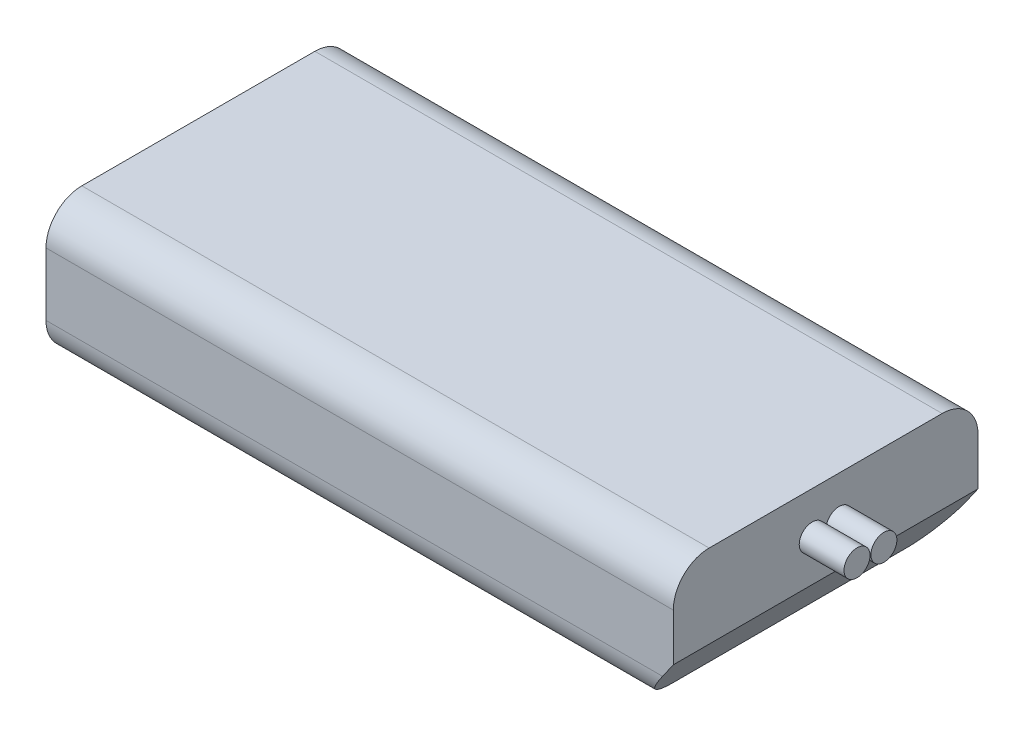
ISO-10303-21;
HEADER;
FILE_DESCRIPTION(('STEP AP214'),'2;1');
FILE_NAME('part.step','',(''),(''),'','','');
FILE_SCHEMA(('AUTOMOTIVE_DESIGN { 1 0 10303 214 1 1 1 1 }'));
ENDSEC;
DATA;
#1=APPLICATION_CONTEXT('core data for automotive mechanical design processes');
#2=APPLICATION_PROTOCOL_DEFINITION('international standard','automotive_design',2000,#1);
#3=PRODUCT_CONTEXT('',#1,'mechanical');
#4=PRODUCT('Part','Part','',(#3));
#5=PRODUCT_RELATED_PRODUCT_CATEGORY('part','',(#4));
#6=PRODUCT_DEFINITION_FORMATION('','',#4);
#7=PRODUCT_DEFINITION_CONTEXT('part definition',#1,'design');
#8=PRODUCT_DEFINITION('design','',#6,#7);
#9=PRODUCT_DEFINITION_SHAPE('','',#8);
#10=(LENGTH_UNIT() NAMED_UNIT(*) SI_UNIT(.MILLI.,.METRE.));
#11=(NAMED_UNIT(*) PLANE_ANGLE_UNIT() SI_UNIT($,.RADIAN.));
#12=(NAMED_UNIT(*) SI_UNIT($,.STERADIAN.) SOLID_ANGLE_UNIT());
#13=UNCERTAINTY_MEASURE_WITH_UNIT(LENGTH_MEASURE(1.E-05),#10,'distance_accuracy_value','');
#14=(GEOMETRIC_REPRESENTATION_CONTEXT(3) GLOBAL_UNCERTAINTY_ASSIGNED_CONTEXT((#13)) GLOBAL_UNIT_ASSIGNED_CONTEXT((#10,
#11,#12)) REPRESENTATION_CONTEXT('',''));
#15=CARTESIAN_POINT('',(0.,0.,0.));
#16=DIRECTION('',(0.,0.,1.));
#17=DIRECTION('',(1.,0.,0.));
#18=AXIS2_PLACEMENT_3D('',#15,#16,#17);
#19=CARTESIAN_POINT('',(17.5,7.5,8.5));
#20=DIRECTION('',(-1.,0.,0.));
#21=DIRECTION('',(0.,0.,1.));
#22=AXIS2_PLACEMENT_3D('',#19,#20,#21);
#23=PLANE('',#22);
#24=CARTESIAN_POINT('',(17.5,5.15797983863386,-0.75));
#25=DIRECTION('',(-1.,0.,0.));
#26=DIRECTION('',(0.,0.,1.));
#27=AXIS2_PLACEMENT_3D('',#24,#25,#26);
#28=CIRCLE('',#27,0.725);
#29=CARTESIAN_POINT('',(17.5,5.15797983863386,-0.0250000000000003));
#30=VERTEX_POINT('',#29);
#31=EDGE_CURVE('E11',#30,#30,#28,.F.);
#32=ORIENTED_EDGE('',*,*,#31,.F.);
#33=EDGE_LOOP('',(#32));
#34=FACE_BOUND('',#33,.T.);
#35=CARTESIAN_POINT('',(17.5,5.15797983863386,0.75));
#36=DIRECTION('',(-1.,0.,0.));
#37=DIRECTION('',(0.,0.,1.));
#38=AXIS2_PLACEMENT_3D('',#35,#36,#37);
#39=CIRCLE('',#38,0.725);
#40=CARTESIAN_POINT('',(17.5,5.15797983863386,1.475));
#41=VERTEX_POINT('',#40);
#42=EDGE_CURVE('E43',#41,#41,#39,.F.);
#43=ORIENTED_EDGE('',*,*,#42,.F.);
#44=EDGE_LOOP('',(#43));
#45=FACE_BOUND('',#44,.T.);
#46=DIRECTION('',(0.,-1.,0.));
#47=VECTOR('',#46,1.);
#48=CARTESIAN_POINT('',(17.5,7.5,-8.5));
#49=LINE('',#48,#47);
#50=CARTESIAN_POINT('',(17.5,5.5,-8.5));
#51=VERTEX_POINT('',#50);
#52=CARTESIAN_POINT('',(17.5,2.85629601348422,-8.5));
#53=VERTEX_POINT('',#52);
#54=EDGE_CURVE('E108',#51,#53,#49,.T.);
#55=ORIENTED_EDGE('',*,*,#54,.F.);
#56=CARTESIAN_POINT('',(17.5,5.5,-6.5));
#57=DIRECTION('',(-1.,0.,0.));
#58=DIRECTION('',(0.,0.,1.));
#59=AXIS2_PLACEMENT_3D('',#56,#57,#58);
#60=CIRCLE('',#59,2.);
#61=CARTESIAN_POINT('',(17.5,7.5,-6.5));
#62=VERTEX_POINT('',#61);
#63=EDGE_CURVE('E50',#51,#62,#60,.F.);
#64=ORIENTED_EDGE('',*,*,#63,.T.);
#65=DIRECTION('',(0.,0.,-1.));
#66=VECTOR('',#65,1.);
#67=CARTESIAN_POINT('',(17.5,7.5,8.5));
#68=LINE('',#67,#66);
#69=CARTESIAN_POINT('',(17.5,7.5,6.5));
#70=VERTEX_POINT('',#69);
#71=EDGE_CURVE('E210',#70,#62,#68,.T.);
#72=ORIENTED_EDGE('',*,*,#71,.F.);
#73=CARTESIAN_POINT('',(17.5,5.5,6.5));
#74=DIRECTION('',(-1.,0.,0.));
#75=DIRECTION('',(0.,0.,1.));
#76=AXIS2_PLACEMENT_3D('',#73,#74,#75);
#77=CIRCLE('',#76,2.);
#78=CARTESIAN_POINT('',(17.5,5.5,8.5));
#79=VERTEX_POINT('',#78);
#80=EDGE_CURVE('E58',#70,#79,#77,.F.);
#81=ORIENTED_EDGE('',*,*,#80,.T.);
#82=DIRECTION('',(0.,-1.,0.));
#83=VECTOR('',#82,1.);
#84=CARTESIAN_POINT('',(17.5,7.5,8.5));
#85=LINE('',#84,#83);
#86=CARTESIAN_POINT('',(17.5,2.85629601348422,8.5));
#87=VERTEX_POINT('',#86);
#88=EDGE_CURVE('E131',#79,#87,#85,.T.);
#89=ORIENTED_EDGE('',*,*,#88,.T.);
#90=DIRECTION('',(0.,0.,-1.));
#91=VECTOR('',#90,1.);
#92=CARTESIAN_POINT('',(17.5,2.85629601348422,-8.5));
#93=LINE('',#92,#91);
#94=EDGE_CURVE('E118',#87,#53,#93,.T.);
#95=ORIENTED_EDGE('',*,*,#94,.T.);
#96=EDGE_LOOP('',(#55,#64,#72,#81,#89,#95));
#97=FACE_BOUND('',#96,.T.);
#98=ADVANCED_FACE('F35',(#34,#45,#97),#23,.F.);
#99=CARTESIAN_POINT('',(-17.5,7.5,-8.5));
#100=DIRECTION('',(0.,0.,1.));
#101=DIRECTION('',(1.,0.,0.));
#102=AXIS2_PLACEMENT_3D('',#99,#100,#101);
#103=PLANE('',#102);
#104=DIRECTION('',(-0.573576436351048,-0.81915204428899,0.));
#105=VECTOR('',#104,1.);
#106=CARTESIAN_POINT('',(17.5,2.85629601348422,-8.5));
#107=LINE('',#106,#105);
#108=CARTESIAN_POINT('',(16.9004150764194,2.,-8.5));
#109=VERTEX_POINT('',#108);
#110=EDGE_CURVE('E112',#53,#109,#107,.T.);
#111=ORIENTED_EDGE('',*,*,#110,.T.);
#112=DIRECTION('',(-1.,0.,0.));
#113=VECTOR('',#112,1.);
#114=CARTESIAN_POINT('',(-17.5,2.,-8.5));
#115=LINE('',#114,#113);
#116=CARTESIAN_POINT('',(-17.5,2.,-8.5));
#117=VERTEX_POINT('',#116);
#118=EDGE_CURVE('E141',#109,#117,#115,.T.);
#119=ORIENTED_EDGE('',*,*,#118,.T.);
#120=DIRECTION('',(0.,-1.,0.));
#121=VECTOR('',#120,1.);
#122=CARTESIAN_POINT('',(-17.5,7.5,-8.5));
#123=LINE('',#122,#121);
#124=CARTESIAN_POINT('',(-17.5,5.5,-8.5));
#125=VERTEX_POINT('',#124);
#126=EDGE_CURVE('E119',#125,#117,#123,.T.);
#127=ORIENTED_EDGE('',*,*,#126,.F.);
#128=DIRECTION('',(-1.,0.,0.));
#129=VECTOR('',#128,1.);
#130=CARTESIAN_POINT('',(-17.5,5.5,-8.5));
#131=LINE('',#130,#129);
#132=EDGE_CURVE('E116',#125,#51,#131,.F.);
#133=ORIENTED_EDGE('',*,*,#132,.T.);
#134=ORIENTED_EDGE('',*,*,#54,.T.);
#135=EDGE_LOOP('',(#111,#119,#127,#133,#134));
#136=FACE_BOUND('',#135,.T.);
#137=ADVANCED_FACE('F110',(#136),#103,.F.);
#138=CARTESIAN_POINT('',(-17.5,7.5,8.5));
#139=DIRECTION('',(1.,0.,0.));
#140=DIRECTION('',(0.,0.,-1.));
#141=AXIS2_PLACEMENT_3D('',#138,#139,#140);
#142=PLANE('',#141);
#143=ORIENTED_EDGE('',*,*,#126,.T.);
#144=CARTESIAN_POINT('',(-17.5,2.,-6.5));
#145=DIRECTION('',(1.,0.,0.));
#146=DIRECTION('',(0.,0.,-1.));
#147=AXIS2_PLACEMENT_3D('',#144,#145,#146);
#148=CIRCLE('',#147,2.);
#149=CARTESIAN_POINT('',(-17.5,0.,-6.5));
#150=VERTEX_POINT('',#149);
#151=EDGE_CURVE('E149',#117,#150,#148,.F.);
#152=ORIENTED_EDGE('',*,*,#151,.T.);
#153=DIRECTION('',(0.,0.,1.));
#154=VECTOR('',#153,1.);
#155=CARTESIAN_POINT('',(-17.5,0.,8.5));
#156=LINE('',#155,#154);
#157=CARTESIAN_POINT('',(-17.5,0.,6.5));
#158=VERTEX_POINT('',#157);
#159=EDGE_CURVE('E218',#150,#158,#156,.T.);
#160=ORIENTED_EDGE('',*,*,#159,.T.);
#161=CARTESIAN_POINT('',(-17.5,2.,6.5));
#162=DIRECTION('',(1.,0.,0.));
#163=DIRECTION('',(0.,0.,-1.));
#164=AXIS2_PLACEMENT_3D('',#161,#162,#163);
#165=CIRCLE('',#164,2.);
#166=CARTESIAN_POINT('',(-17.5,2.,8.5));
#167=VERTEX_POINT('',#166);
#168=EDGE_CURVE('E147',#158,#167,#165,.F.);
#169=ORIENTED_EDGE('',*,*,#168,.T.);
#170=DIRECTION('',(0.,-1.,0.));
#171=VECTOR('',#170,1.);
#172=CARTESIAN_POINT('',(-17.5,7.5,8.5));
#173=LINE('',#172,#171);
#174=CARTESIAN_POINT('',(-17.5,5.5,8.5));
#175=VERTEX_POINT('',#174);
#176=EDGE_CURVE('E216',#175,#167,#173,.T.);
#177=ORIENTED_EDGE('',*,*,#176,.F.);
#178=CARTESIAN_POINT('',(-17.5,5.5,6.5));
#179=DIRECTION('',(1.,0.,0.));
#180=DIRECTION('',(0.,0.,-1.));
#181=AXIS2_PLACEMENT_3D('',#178,#179,#180);
#182=CIRCLE('',#181,2.);
#183=CARTESIAN_POINT('',(-17.5,7.5,6.5));
#184=VERTEX_POINT('',#183);
#185=EDGE_CURVE('E143',#175,#184,#182,.F.);
#186=ORIENTED_EDGE('',*,*,#185,.T.);
#187=DIRECTION('',(0.,0.,1.));
#188=VECTOR('',#187,1.);
#189=CARTESIAN_POINT('',(-17.5,7.5,8.5));
#190=LINE('',#189,#188);
#191=CARTESIAN_POINT('',(-17.5,7.5,-6.5));
#192=VERTEX_POINT('',#191);
#193=EDGE_CURVE('E209',#192,#184,#190,.T.);
#194=ORIENTED_EDGE('',*,*,#193,.F.);
#195=CARTESIAN_POINT('',(-17.5,5.5,-6.5));
#196=DIRECTION('',(1.,0.,0.));
#197=DIRECTION('',(0.,0.,-1.));
#198=AXIS2_PLACEMENT_3D('',#195,#196,#197);
#199=CIRCLE('',#198,2.);
#200=EDGE_CURVE('E145',#192,#125,#199,.F.);
#201=ORIENTED_EDGE('',*,*,#200,.T.);
#202=EDGE_LOOP('',(#143,#152,#160,#169,#177,#186,#194,#201));
#203=FACE_BOUND('',#202,.T.);
#204=ADVANCED_FACE('F180',(#203),#142,.F.);
#205=CARTESIAN_POINT('',(-17.5,7.5,8.5));
#206=DIRECTION('',(0.,0.,-1.));
#207=DIRECTION('',(-1.,0.,0.));
#208=AXIS2_PLACEMENT_3D('',#205,#206,#207);
#209=PLANE('',#208);
#210=ORIENTED_EDGE('',*,*,#176,.T.);
#211=DIRECTION('',(1.,0.,0.));
#212=VECTOR('',#211,1.);
#213=CARTESIAN_POINT('',(15.5,2.,8.5));
#214=LINE('',#213,#212);
#215=CARTESIAN_POINT('',(16.9004150764194,2.,8.5));
#216=VERTEX_POINT('',#215);
#217=EDGE_CURVE('E160',#167,#216,#214,.T.);
#218=ORIENTED_EDGE('',*,*,#217,.T.);
#219=DIRECTION('',(0.573576436351048,0.81915204428899,0.));
#220=VECTOR('',#219,1.);
#221=CARTESIAN_POINT('',(17.5,2.85629601348422,8.5));
#222=LINE('',#221,#220);
#223=EDGE_CURVE('E138',#216,#87,#222,.T.);
#224=ORIENTED_EDGE('',*,*,#223,.T.);
#225=ORIENTED_EDGE('',*,*,#88,.F.);
#226=DIRECTION('',(1.,0.,0.));
#227=VECTOR('',#226,1.);
#228=CARTESIAN_POINT('',(-17.5,5.5,8.5));
#229=LINE('',#228,#227);
#230=EDGE_CURVE('E158',#79,#175,#229,.F.);
#231=ORIENTED_EDGE('',*,*,#230,.T.);
#232=EDGE_LOOP('',(#210,#218,#224,#225,#231));
#233=FACE_BOUND('',#232,.T.);
#234=ADVANCED_FACE('F233',(#233),#209,.F.);
#235=CARTESIAN_POINT('',(0.,7.5,0.));
#236=DIRECTION('',(0.,-1.,0.));
#237=DIRECTION('',(0.,0.,-1.));
#238=AXIS2_PLACEMENT_3D('',#235,#236,#237);
#239=PLANE('',#238);
#240=ORIENTED_EDGE('',*,*,#71,.T.);
#241=DIRECTION('',(-1.,0.,0.));
#242=VECTOR('',#241,1.);
#243=CARTESIAN_POINT('',(0.,7.5,-6.5));
#244=LINE('',#243,#242);
#245=EDGE_CURVE('E165',#62,#192,#244,.T.);
#246=ORIENTED_EDGE('',*,*,#245,.T.);
#247=ORIENTED_EDGE('',*,*,#193,.T.);
#248=DIRECTION('',(1.,0.,0.));
#249=VECTOR('',#248,1.);
#250=CARTESIAN_POINT('',(0.,7.5,6.5));
#251=LINE('',#250,#249);
#252=EDGE_CURVE('E163',#184,#70,#251,.T.);
#253=ORIENTED_EDGE('',*,*,#252,.T.);
#254=EDGE_LOOP('',(#240,#246,#247,#253));
#255=FACE_BOUND('',#254,.T.);
#256=ADVANCED_FACE('F208',(#255),#239,.F.);
#257=CARTESIAN_POINT('',(0.,0.,0.));
#258=DIRECTION('',(0.,-1.,0.));
#259=DIRECTION('',(0.,0.,-1.));
#260=AXIS2_PLACEMENT_3D('',#257,#258,#259);
#261=PLANE('',#260);
#262=ORIENTED_EDGE('',*,*,#159,.F.);
#263=DIRECTION('',(-1.,0.,0.));
#264=VECTOR('',#263,1.);
#265=CARTESIAN_POINT('',(15.5,0.,-6.5));
#266=LINE('',#265,#264);
#267=CARTESIAN_POINT('',(15.5,0.,-6.5));
#268=VERTEX_POINT('',#267);
#269=EDGE_CURVE('E153',#150,#268,#266,.F.);
#270=ORIENTED_EDGE('',*,*,#269,.T.);
#271=DIRECTION('',(0.,0.,1.));
#272=VECTOR('',#271,1.);
#273=CARTESIAN_POINT('',(15.5,0.,8.5));
#274=LINE('',#273,#272);
#275=CARTESIAN_POINT('',(15.5,0.,6.5));
#276=VERTEX_POINT('',#275);
#277=EDGE_CURVE('E128',#268,#276,#274,.T.);
#278=ORIENTED_EDGE('',*,*,#277,.T.);
#279=DIRECTION('',(1.,0.,0.));
#280=VECTOR('',#279,1.);
#281=CARTESIAN_POINT('',(-17.5,0.,6.5));
#282=LINE('',#281,#280);
#283=EDGE_CURVE('E151',#276,#158,#282,.F.);
#284=ORIENTED_EDGE('',*,*,#283,.T.);
#285=EDGE_LOOP('',(#262,#270,#278,#284));
#286=FACE_BOUND('',#285,.T.);
#287=ADVANCED_FACE('F191',(#286),#261,.T.);
#288=CARTESIAN_POINT('',(17.5,2.85629601348422,8.5));
#289=DIRECTION('',(0.81915204428899,-0.573576436351048,0.));
#290=DIRECTION('',(0.,0.,1.));
#291=AXIS2_PLACEMENT_3D('',#288,#289,#290);
#292=PLANE('',#291);
#293=ORIENTED_EDGE('',*,*,#277,.F.);
#294=CARTESIAN_POINT('',(16.9004150764194,2.,-6.5));
#295=DIRECTION('',(0.81915204428899,-0.573576436351048,0.));
#296=DIRECTION('',(0.573576436351048,0.81915204428899,0.));
#297=AXIS2_PLACEMENT_3D('',#294,#295,#296);
#298=ELLIPSE('',#297,2.44154917752292,2.);
#299=EDGE_CURVE('E127',#268,#109,#298,.T.);
#300=ORIENTED_EDGE('',*,*,#299,.T.);
#301=ORIENTED_EDGE('',*,*,#110,.F.);
#302=ORIENTED_EDGE('',*,*,#94,.F.);
#303=ORIENTED_EDGE('',*,*,#223,.F.);
#304=CARTESIAN_POINT('',(16.9004150764194,2.,6.5));
#305=DIRECTION('',(0.81915204428899,-0.573576436351048,0.));
#306=DIRECTION('',(-0.573576436351048,-0.81915204428899,0.));
#307=AXIS2_PLACEMENT_3D('',#304,#305,#306);
#308=ELLIPSE('',#307,2.44154917752292,2.);
#309=EDGE_CURVE('E155',#216,#276,#308,.T.);
#310=ORIENTED_EDGE('',*,*,#309,.T.);
#311=EDGE_LOOP('',(#293,#300,#301,#302,#303,#310));
#312=FACE_BOUND('',#311,.T.);
#313=ADVANCED_FACE('F124',(#312),#292,.T.);
#314=CARTESIAN_POINT('',(-17.5,2.,-6.5));
#315=DIRECTION('',(1.,0.,0.));
#316=DIRECTION('',(0.,0.,-1.));
#317=AXIS2_PLACEMENT_3D('',#314,#315,#316);
#318=CYLINDRICAL_SURFACE('',#317,2.);
#319=ORIENTED_EDGE('',*,*,#299,.F.);
#320=ORIENTED_EDGE('',*,*,#269,.F.);
#321=ORIENTED_EDGE('',*,*,#151,.F.);
#322=ORIENTED_EDGE('',*,*,#118,.F.);
#323=EDGE_LOOP('',(#319,#320,#321,#322));
#324=FACE_BOUND('',#323,.T.);
#325=ADVANCED_FACE('F190',(#324),#318,.T.);
#326=CARTESIAN_POINT('',(-17.5,2.,6.5));
#327=DIRECTION('',(-1.,0.,0.));
#328=DIRECTION('',(0.,0.,1.));
#329=AXIS2_PLACEMENT_3D('',#326,#327,#328);
#330=CYLINDRICAL_SURFACE('',#329,2.);
#331=ORIENTED_EDGE('',*,*,#168,.F.);
#332=ORIENTED_EDGE('',*,*,#283,.F.);
#333=ORIENTED_EDGE('',*,*,#309,.F.);
#334=ORIENTED_EDGE('',*,*,#217,.F.);
#335=EDGE_LOOP('',(#331,#332,#333,#334));
#336=FACE_BOUND('',#335,.T.);
#337=ADVANCED_FACE('F194',(#336),#330,.T.);
#338=CARTESIAN_POINT('',(0.,5.5,-6.5));
#339=DIRECTION('',(-1.,0.,0.));
#340=DIRECTION('',(0.,0.,1.));
#341=AXIS2_PLACEMENT_3D('',#338,#339,#340);
#342=CYLINDRICAL_SURFACE('',#341,2.);
#343=ORIENTED_EDGE('',*,*,#63,.F.);
#344=ORIENTED_EDGE('',*,*,#132,.F.);
#345=ORIENTED_EDGE('',*,*,#200,.F.);
#346=ORIENTED_EDGE('',*,*,#245,.F.);
#347=EDGE_LOOP('',(#343,#344,#345,#346));
#348=FACE_BOUND('',#347,.T.);
#349=ADVANCED_FACE('F197',(#348),#342,.T.);
#350=CARTESIAN_POINT('',(0.,5.5,6.5));
#351=DIRECTION('',(1.,0.,0.));
#352=DIRECTION('',(0.,0.,-1.));
#353=AXIS2_PLACEMENT_3D('',#350,#351,#352);
#354=CYLINDRICAL_SURFACE('',#353,2.);
#355=ORIENTED_EDGE('',*,*,#185,.F.);
#356=ORIENTED_EDGE('',*,*,#230,.F.);
#357=ORIENTED_EDGE('',*,*,#80,.F.);
#358=ORIENTED_EDGE('',*,*,#252,.F.);
#359=EDGE_LOOP('',(#355,#356,#357,#358));
#360=FACE_BOUND('',#359,.T.);
#361=ADVANCED_FACE('F37',(#360),#354,.T.);
#362=CARTESIAN_POINT('',(20.,5.15797983863386,0.75));
#363=DIRECTION('',(-1.,0.,0.));
#364=DIRECTION('',(0.,0.,1.));
#365=AXIS2_PLACEMENT_3D('',#362,#363,#364);
#366=CYLINDRICAL_SURFACE('',#365,0.725);
#367=CARTESIAN_POINT('',(20.,5.15797983863386,0.75));
#368=DIRECTION('',(1.,0.,0.));
#369=DIRECTION('',(0.,0.,-1.));
#370=AXIS2_PLACEMENT_3D('',#367,#368,#369);
#371=CIRCLE('',#370,0.725);
#372=CARTESIAN_POINT('',(20.,5.15797983863386,0.0249999999999998));
#373=VERTEX_POINT('',#372);
#374=EDGE_CURVE('E223',#373,#373,#371,.T.);
#375=ORIENTED_EDGE('',*,*,#374,.F.);
#376=EDGE_LOOP('',(#375));
#377=FACE_BOUND('',#376,.T.);
#378=ORIENTED_EDGE('',*,*,#42,.T.);
#379=EDGE_LOOP('',(#378));
#380=FACE_BOUND('',#379,.T.);
#381=ADVANCED_FACE('F172',(#377,#380),#366,.T.);
#382=CARTESIAN_POINT('',(20.,5.15797983863386,0.75));
#383=DIRECTION('',(1.,0.,0.));
#384=DIRECTION('',(0.,0.,-1.));
#385=AXIS2_PLACEMENT_3D('',#382,#383,#384);
#386=PLANE('',#385);
#387=ORIENTED_EDGE('',*,*,#374,.T.);
#388=EDGE_LOOP('',(#387));
#389=FACE_BOUND('',#388,.T.);
#390=ADVANCED_FACE('F246',(#389),#386,.T.);
#391=CARTESIAN_POINT('',(20.,5.15797983863386,-0.75));
#392=DIRECTION('',(-1.,0.,0.));
#393=DIRECTION('',(0.,0.,1.));
#394=AXIS2_PLACEMENT_3D('',#391,#392,#393);
#395=CYLINDRICAL_SURFACE('',#394,0.725);
#396=CARTESIAN_POINT('',(20.,5.15797983863386,-0.75));
#397=DIRECTION('',(1.,0.,0.));
#398=DIRECTION('',(0.,0.,-1.));
#399=AXIS2_PLACEMENT_3D('',#396,#397,#398);
#400=CIRCLE('',#399,0.725);
#401=CARTESIAN_POINT('',(20.,5.15797983863386,-1.475));
#402=VERTEX_POINT('',#401);
#403=EDGE_CURVE('E262',#402,#402,#400,.T.);
#404=ORIENTED_EDGE('',*,*,#403,.F.);
#405=EDGE_LOOP('',(#404));
#406=FACE_BOUND('',#405,.T.);
#407=ORIENTED_EDGE('',*,*,#31,.T.);
#408=EDGE_LOOP('',(#407));
#409=FACE_BOUND('',#408,.T.);
#410=ADVANCED_FACE('F250',(#406,#409),#395,.T.);
#411=CARTESIAN_POINT('',(20.,5.15797983863386,-0.75));
#412=DIRECTION('',(1.,0.,0.));
#413=DIRECTION('',(0.,0.,-1.));
#414=AXIS2_PLACEMENT_3D('',#411,#412,#413);
#415=PLANE('',#414);
#416=ORIENTED_EDGE('',*,*,#403,.T.);
#417=EDGE_LOOP('',(#416));
#418=FACE_BOUND('',#417,.T.);
#419=ADVANCED_FACE('F254',(#418),#415,.T.);
#420=CLOSED_SHELL('',(#98,#137,#204,#234,#256,#287,#313,#325,#337,#349,#361,#381,#390,#410,#419));
#421=MANIFOLD_SOLID_BREP('B2',#420);
#422=ADVANCED_BREP_SHAPE_REPRESENTATION('',(#18,#421),#14);
#423=SHAPE_DEFINITION_REPRESENTATION(#9,#422);
ENDSEC;
END-ISO-10303-21;
